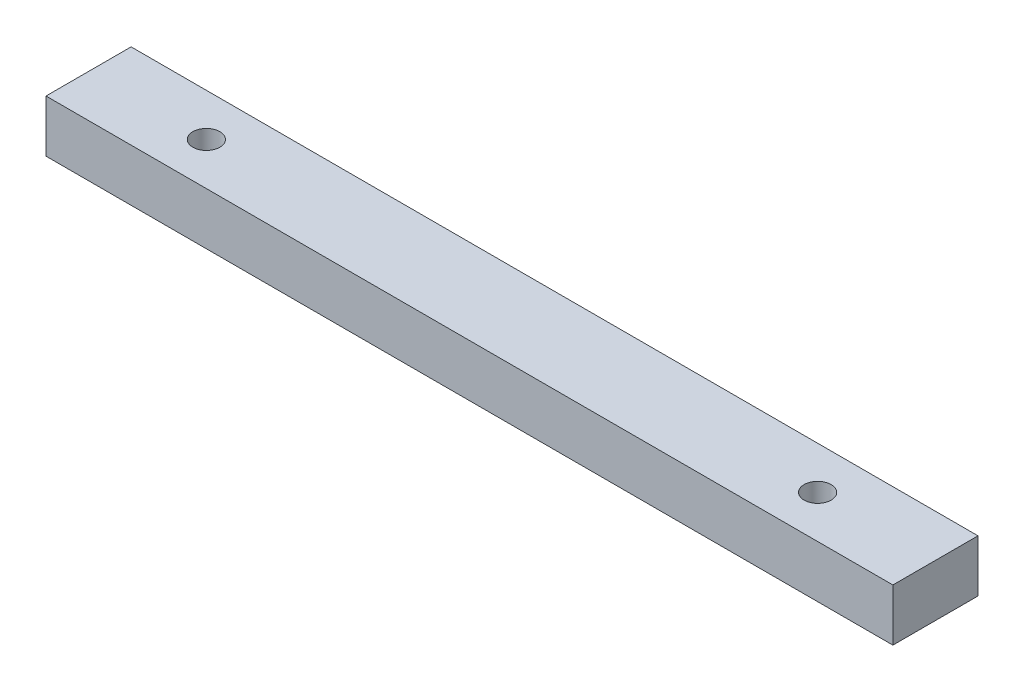
ISO-10303-21;
HEADER;
FILE_DESCRIPTION(('STEP AP214'),'2;1');
FILE_NAME('part.step','',(''),(''),'','','');
FILE_SCHEMA(('AUTOMOTIVE_DESIGN { 1 0 10303 214 1 1 1 1 }'));
ENDSEC;
DATA;
#1=APPLICATION_CONTEXT('core data for automotive mechanical design processes');
#2=APPLICATION_PROTOCOL_DEFINITION('international standard','automotive_design',2000,#1);
#3=PRODUCT_CONTEXT('',#1,'mechanical');
#4=PRODUCT('Part','Part','',(#3));
#5=PRODUCT_RELATED_PRODUCT_CATEGORY('part','',(#4));
#6=PRODUCT_DEFINITION_FORMATION('','',#4);
#7=PRODUCT_DEFINITION_CONTEXT('part definition',#1,'design');
#8=PRODUCT_DEFINITION('design','',#6,#7);
#9=PRODUCT_DEFINITION_SHAPE('','',#8);
#10=(LENGTH_UNIT() NAMED_UNIT(*) SI_UNIT(.MILLI.,.METRE.));
#11=(NAMED_UNIT(*) PLANE_ANGLE_UNIT() SI_UNIT($,.RADIAN.));
#12=(NAMED_UNIT(*) SI_UNIT($,.STERADIAN.) SOLID_ANGLE_UNIT());
#13=UNCERTAINTY_MEASURE_WITH_UNIT(LENGTH_MEASURE(1.E-05),#10,'distance_accuracy_value','');
#14=(GEOMETRIC_REPRESENTATION_CONTEXT(3) GLOBAL_UNCERTAINTY_ASSIGNED_CONTEXT((#13)) GLOBAL_UNIT_ASSIGNED_CONTEXT((#10,
#11,#12)) REPRESENTATION_CONTEXT('',''));
#15=CARTESIAN_POINT('',(0.,0.,0.));
#16=DIRECTION('',(0.,0.,1.));
#17=DIRECTION('',(1.,0.,0.));
#18=AXIS2_PLACEMENT_3D('',#15,#16,#17);
#19=CARTESIAN_POINT('',(-7.3931718061674,14.7323788546255,40.));
#20=DIRECTION('',(1.,0.,0.));
#21=DIRECTION('',(0.,0.,-1.));
#22=AXIS2_PLACEMENT_3D('',#19,#20,#21);
#23=PLANE('',#22);
#24=DIRECTION('',(0.,-1.,0.));
#25=VECTOR('',#24,1.);
#26=CARTESIAN_POINT('',(-7.3931718061674,14.7323788546255,0.));
#27=LINE('',#26,#25);
#28=CARTESIAN_POINT('',(-7.3931718061674,14.7323788546255,0.));
#29=VERTEX_POINT('',#28);
#30=CARTESIAN_POINT('',(-7.3931718061674,-9.76762114537445,0.));
#31=VERTEX_POINT('',#30);
#32=EDGE_CURVE('E114',#29,#31,#27,.T.);
#33=ORIENTED_EDGE('',*,*,#32,.T.);
#34=DIRECTION('',(0.,0.,-1.));
#35=VECTOR('',#34,1.);
#36=CARTESIAN_POINT('',(-7.3931718061674,-9.76762114537445,40.));
#37=LINE('',#36,#35);
#38=CARTESIAN_POINT('',(-7.3931718061674,-9.76762114537445,40.));
#39=VERTEX_POINT('',#38);
#40=EDGE_CURVE('E11',#39,#31,#37,.T.);
#41=ORIENTED_EDGE('',*,*,#40,.F.);
#42=DIRECTION('',(0.,-1.,0.));
#43=VECTOR('',#42,1.);
#44=CARTESIAN_POINT('',(-7.3931718061674,14.7323788546255,40.));
#45=LINE('',#44,#43);
#46=CARTESIAN_POINT('',(-7.3931718061674,14.7323788546255,40.));
#47=VERTEX_POINT('',#46);
#48=EDGE_CURVE('E100',#47,#39,#45,.T.);
#49=ORIENTED_EDGE('',*,*,#48,.F.);
#50=DIRECTION('',(0.,0.,-1.));
#51=VECTOR('',#50,1.);
#52=CARTESIAN_POINT('',(-7.3931718061674,14.7323788546255,40.));
#53=LINE('',#52,#51);
#54=EDGE_CURVE('E108',#47,#29,#53,.T.);
#55=ORIENTED_EDGE('',*,*,#54,.T.);
#56=EDGE_LOOP('',(#33,#41,#49,#55));
#57=FACE_BOUND('',#56,.T.);
#58=ADVANCED_FACE('F44',(#57),#23,.F.);
#59=CARTESIAN_POINT('',(-7.3931718061674,-9.76762114537445,40.));
#60=DIRECTION('',(0.,1.,0.));
#61=DIRECTION('',(0.,0.,1.));
#62=AXIS2_PLACEMENT_3D('',#59,#60,#61);
#63=PLANE('',#62);
#64=CARTESIAN_POINT('',(335.234828193833,-9.76762114537445,20.));
#65=DIRECTION('',(0.,1.,0.));
#66=DIRECTION('',(0.,0.,1.));
#67=AXIS2_PLACEMENT_3D('',#64,#65,#66);
#68=CIRCLE('',#67,6.35);
#69=CARTESIAN_POINT('',(335.234828193833,-9.76762114537445,26.35));
#70=VERTEX_POINT('',#69);
#71=EDGE_CURVE('E120',#70,#70,#68,.T.);
#72=ORIENTED_EDGE('',*,*,#71,.T.);
#73=EDGE_LOOP('',(#72));
#74=FACE_BOUND('',#73,.T.);
#75=CARTESIAN_POINT('',(47.9788281938326,-9.76762114537445,20.));
#76=DIRECTION('',(0.,1.,0.));
#77=DIRECTION('',(0.,0.,1.));
#78=AXIS2_PLACEMENT_3D('',#75,#76,#77);
#79=CIRCLE('',#78,6.35);
#80=CARTESIAN_POINT('',(47.9788281938326,-9.76762114537445,26.35));
#81=VERTEX_POINT('',#80);
#82=EDGE_CURVE('E140',#81,#81,#79,.T.);
#83=ORIENTED_EDGE('',*,*,#82,.T.);
#84=EDGE_LOOP('',(#83));
#85=FACE_BOUND('',#84,.T.);
#86=DIRECTION('',(1.,0.,0.));
#87=VECTOR('',#86,1.);
#88=CARTESIAN_POINT('',(-7.3931718061674,-9.76762114537445,0.));
#89=LINE('',#88,#87);
#90=CARTESIAN_POINT('',(390.606828193833,-9.76762114537445,0.));
#91=VERTEX_POINT('',#90);
#92=EDGE_CURVE('E105',#31,#91,#89,.T.);
#93=ORIENTED_EDGE('',*,*,#92,.T.);
#94=DIRECTION('',(0.,0.,-1.));
#95=VECTOR('',#94,1.);
#96=CARTESIAN_POINT('',(390.606828193833,-9.76762114537445,40.));
#97=LINE('',#96,#95);
#98=CARTESIAN_POINT('',(390.606828193833,-9.76762114537445,40.));
#99=VERTEX_POINT('',#98);
#100=EDGE_CURVE('E53',#99,#91,#97,.T.);
#101=ORIENTED_EDGE('',*,*,#100,.F.);
#102=DIRECTION('',(1.,0.,0.));
#103=VECTOR('',#102,1.);
#104=CARTESIAN_POINT('',(-7.3931718061674,-9.76762114537445,40.));
#105=LINE('',#104,#103);
#106=EDGE_CURVE('E95',#39,#99,#105,.T.);
#107=ORIENTED_EDGE('',*,*,#106,.F.);
#108=ORIENTED_EDGE('',*,*,#40,.T.);
#109=EDGE_LOOP('',(#93,#101,#107,#108));
#110=FACE_BOUND('',#109,.T.);
#111=ADVANCED_FACE('F101',(#74,#85,#110),#63,.F.);
#112=CARTESIAN_POINT('',(390.606828193833,14.7323788546255,40.));
#113=DIRECTION('',(-1.,0.,0.));
#114=DIRECTION('',(0.,0.,1.));
#115=AXIS2_PLACEMENT_3D('',#112,#113,#114);
#116=PLANE('',#115);
#117=DIRECTION('',(0.,1.,0.));
#118=VECTOR('',#117,1.);
#119=CARTESIAN_POINT('',(390.606828193833,14.7323788546255,0.));
#120=LINE('',#119,#118);
#121=CARTESIAN_POINT('',(390.606828193833,14.7323788546255,0.));
#122=VERTEX_POINT('',#121);
#123=EDGE_CURVE('E79',#91,#122,#120,.T.);
#124=ORIENTED_EDGE('',*,*,#123,.T.);
#125=DIRECTION('',(0.,0.,-1.));
#126=VECTOR('',#125,1.);
#127=CARTESIAN_POINT('',(390.606828193833,14.7323788546255,40.));
#128=LINE('',#127,#126);
#129=CARTESIAN_POINT('',(390.606828193833,14.7323788546255,40.));
#130=VERTEX_POINT('',#129);
#131=EDGE_CURVE('E102',#130,#122,#128,.T.);
#132=ORIENTED_EDGE('',*,*,#131,.F.);
#133=DIRECTION('',(0.,1.,0.));
#134=VECTOR('',#133,1.);
#135=CARTESIAN_POINT('',(390.606828193833,14.7323788546255,40.));
#136=LINE('',#135,#134);
#137=EDGE_CURVE('E92',#99,#130,#136,.T.);
#138=ORIENTED_EDGE('',*,*,#137,.F.);
#139=ORIENTED_EDGE('',*,*,#100,.T.);
#140=EDGE_LOOP('',(#124,#132,#138,#139));
#141=FACE_BOUND('',#140,.T.);
#142=ADVANCED_FACE('F104',(#141),#116,.F.);
#143=CARTESIAN_POINT('',(-7.3931718061674,14.7323788546255,40.));
#144=DIRECTION('',(0.,-1.,0.));
#145=DIRECTION('',(1.,0.,0.));
#146=AXIS2_PLACEMENT_3D('',#143,#144,#145);
#147=PLANE('',#146);
#148=CARTESIAN_POINT('',(335.234828193833,14.7323788546255,20.));
#149=DIRECTION('',(0.,1.,0.));
#150=DIRECTION('',(-1.,0.,0.));
#151=AXIS2_PLACEMENT_3D('',#148,#149,#150);
#152=CIRCLE('',#151,6.35);
#153=CARTESIAN_POINT('',(328.884828193833,14.7323788546255,20.));
#154=VERTEX_POINT('',#153);
#155=EDGE_CURVE('E143',#154,#154,#152,.T.);
#156=ORIENTED_EDGE('',*,*,#155,.F.);
#157=EDGE_LOOP('',(#156));
#158=FACE_BOUND('',#157,.T.);
#159=CARTESIAN_POINT('',(47.9788281938326,14.7323788546255,20.));
#160=DIRECTION('',(0.,1.,0.));
#161=DIRECTION('',(-1.,0.,0.));
#162=AXIS2_PLACEMENT_3D('',#159,#160,#161);
#163=CIRCLE('',#162,6.35);
#164=CARTESIAN_POINT('',(41.6288281938326,14.7323788546255,20.));
#165=VERTEX_POINT('',#164);
#166=EDGE_CURVE('E142',#165,#165,#163,.T.);
#167=ORIENTED_EDGE('',*,*,#166,.F.);
#168=EDGE_LOOP('',(#167));
#169=FACE_BOUND('',#168,.T.);
#170=DIRECTION('',(-1.,0.,0.));
#171=VECTOR('',#170,1.);
#172=CARTESIAN_POINT('',(-7.3931718061674,14.7323788546255,0.));
#173=LINE('',#172,#171);
#174=EDGE_CURVE('E83',#122,#29,#173,.T.);
#175=ORIENTED_EDGE('',*,*,#174,.T.);
#176=ORIENTED_EDGE('',*,*,#54,.F.);
#177=DIRECTION('',(-1.,0.,0.));
#178=VECTOR('',#177,1.);
#179=CARTESIAN_POINT('',(-7.3931718061674,14.7323788546255,40.));
#180=LINE('',#179,#178);
#181=EDGE_CURVE('E65',#130,#47,#180,.T.);
#182=ORIENTED_EDGE('',*,*,#181,.F.);
#183=ORIENTED_EDGE('',*,*,#131,.T.);
#184=EDGE_LOOP('',(#175,#176,#182,#183));
#185=FACE_BOUND('',#184,.T.);
#186=ADVANCED_FACE('F130',(#158,#169,#185),#147,.F.);
#187=CARTESIAN_POINT('',(0.,0.,40.));
#188=DIRECTION('',(0.,0.,1.));
#189=DIRECTION('',(1.,0.,0.));
#190=AXIS2_PLACEMENT_3D('',#187,#188,#189);
#191=PLANE('',#190);
#192=ORIENTED_EDGE('',*,*,#48,.T.);
#193=ORIENTED_EDGE('',*,*,#106,.T.);
#194=ORIENTED_EDGE('',*,*,#137,.T.);
#195=ORIENTED_EDGE('',*,*,#181,.T.);
#196=EDGE_LOOP('',(#192,#193,#194,#195));
#197=FACE_BOUND('',#196,.T.);
#198=ADVANCED_FACE('F91',(#197),#191,.T.);
#199=CARTESIAN_POINT('',(0.,0.,0.));
#200=DIRECTION('',(0.,0.,1.));
#201=DIRECTION('',(1.,0.,0.));
#202=AXIS2_PLACEMENT_3D('',#199,#200,#201);
#203=PLANE('',#202);
#204=ORIENTED_EDGE('',*,*,#32,.F.);
#205=ORIENTED_EDGE('',*,*,#174,.F.);
#206=ORIENTED_EDGE('',*,*,#123,.F.);
#207=ORIENTED_EDGE('',*,*,#92,.F.);
#208=EDGE_LOOP('',(#204,#205,#206,#207));
#209=FACE_BOUND('',#208,.T.);
#210=ADVANCED_FACE('F128',(#209),#203,.F.);
#211=CARTESIAN_POINT('',(47.9788281938326,-25.2676211453745,20.));
#212=DIRECTION('',(0.,1.,0.));
#213=DIRECTION('',(-1.,0.,0.));
#214=AXIS2_PLACEMENT_3D('',#211,#212,#213);
#215=CYLINDRICAL_SURFACE('',#214,6.35);
#216=ORIENTED_EDGE('',*,*,#166,.T.);
#217=EDGE_LOOP('',(#216));
#218=FACE_BOUND('',#217,.T.);
#219=ORIENTED_EDGE('',*,*,#82,.F.);
#220=EDGE_LOOP('',(#219));
#221=FACE_BOUND('',#220,.T.);
#222=ADVANCED_FACE('F158',(#218,#221),#215,.F.);
#223=CARTESIAN_POINT('',(335.234828193833,-25.2676211453745,20.));
#224=DIRECTION('',(0.,1.,0.));
#225=DIRECTION('',(-1.,0.,0.));
#226=AXIS2_PLACEMENT_3D('',#223,#224,#225);
#227=CYLINDRICAL_SURFACE('',#226,6.35);
#228=ORIENTED_EDGE('',*,*,#155,.T.);
#229=EDGE_LOOP('',(#228));
#230=FACE_BOUND('',#229,.T.);
#231=ORIENTED_EDGE('',*,*,#71,.F.);
#232=EDGE_LOOP('',(#231));
#233=FACE_BOUND('',#232,.T.);
#234=ADVANCED_FACE('F147',(#230,#233),#227,.F.);
#235=CLOSED_SHELL('',(#58,#111,#142,#186,#198,#210,#222,#234));
#236=MANIFOLD_SOLID_BREP('B2',#235);
#237=ADVANCED_BREP_SHAPE_REPRESENTATION('',(#18,#236),#14);
#238=SHAPE_DEFINITION_REPRESENTATION(#9,#237);
ENDSEC;
END-ISO-10303-21;
